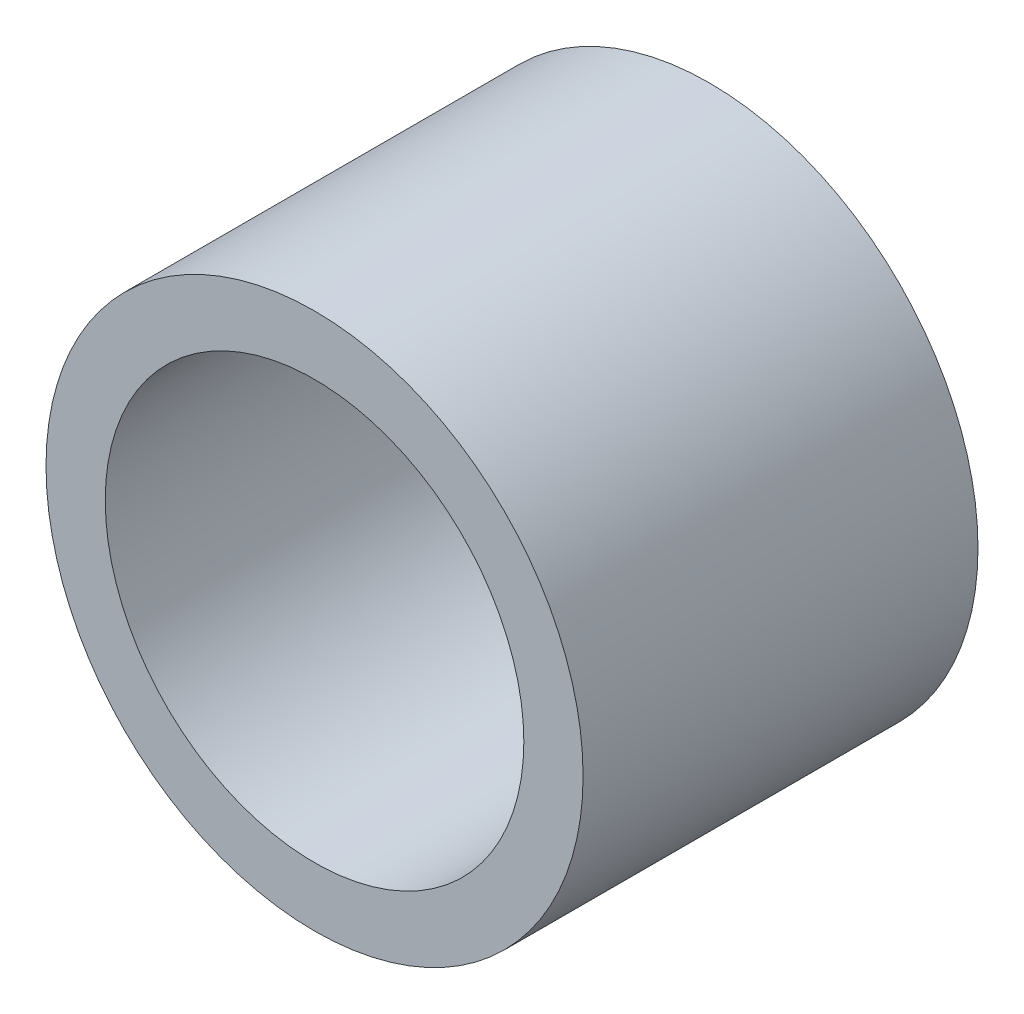
ISO-10303-21;
HEADER;
FILE_DESCRIPTION(('STEP AP214'),'2;1');
FILE_NAME('part.step','',(''),(''),'','','');
FILE_SCHEMA(('AUTOMOTIVE_DESIGN { 1 0 10303 214 1 1 1 1 }'));
ENDSEC;
DATA;
#1=APPLICATION_CONTEXT('core data for automotive mechanical design processes');
#2=APPLICATION_PROTOCOL_DEFINITION('international standard','automotive_design',2000,#1);
#3=PRODUCT_CONTEXT('',#1,'mechanical');
#4=PRODUCT('Part','Part','',(#3));
#5=PRODUCT_RELATED_PRODUCT_CATEGORY('part','',(#4));
#6=PRODUCT_DEFINITION_FORMATION('','',#4);
#7=PRODUCT_DEFINITION_CONTEXT('part definition',#1,'design');
#8=PRODUCT_DEFINITION('design','',#6,#7);
#9=PRODUCT_DEFINITION_SHAPE('','',#8);
#10=(LENGTH_UNIT() NAMED_UNIT(*) SI_UNIT(.MILLI.,.METRE.));
#11=(NAMED_UNIT(*) PLANE_ANGLE_UNIT() SI_UNIT($,.RADIAN.));
#12=(NAMED_UNIT(*) SI_UNIT($,.STERADIAN.) SOLID_ANGLE_UNIT());
#13=UNCERTAINTY_MEASURE_WITH_UNIT(LENGTH_MEASURE(1.E-05),#10,'distance_accuracy_value','');
#14=(GEOMETRIC_REPRESENTATION_CONTEXT(3) GLOBAL_UNCERTAINTY_ASSIGNED_CONTEXT((#13)) GLOBAL_UNIT_ASSIGNED_CONTEXT((#10,
#11,#12)) REPRESENTATION_CONTEXT('',''));
#15=CARTESIAN_POINT('',(0.,0.,0.));
#16=DIRECTION('',(0.,0.,1.));
#17=DIRECTION('',(1.,0.,0.));
#18=AXIS2_PLACEMENT_3D('',#15,#16,#17);
#19=CARTESIAN_POINT('',(0.,0.,5.));
#20=DIRECTION('',(0.,0.,1.));
#21=DIRECTION('',(1.,0.,0.));
#22=AXIS2_PLACEMENT_3D('',#19,#20,#21);
#23=PLANE('',#22);
#24=CARTESIAN_POINT('',(0.,0.,5.));
#25=DIRECTION('',(0.,0.,1.));
#26=DIRECTION('',(1.,0.,0.));
#27=AXIS2_PLACEMENT_3D('',#24,#25,#26);
#28=CIRCLE('',#27,3.4);
#29=CARTESIAN_POINT('',(3.4,0.,5.));
#30=VERTEX_POINT('',#29);
#31=EDGE_CURVE('E10',#30,#30,#28,.T.);
#32=ORIENTED_EDGE('',*,*,#31,.T.);
#33=EDGE_LOOP('',(#32));
#34=FACE_BOUND('',#33,.T.);
#35=CARTESIAN_POINT('',(0.,0.,5.));
#36=DIRECTION('',(0.,0.,1.));
#37=DIRECTION('',(1.,0.,0.));
#38=AXIS2_PLACEMENT_3D('',#35,#36,#37);
#39=CIRCLE('',#38,2.65);
#40=CARTESIAN_POINT('',(2.65,0.,5.));
#41=VERTEX_POINT('',#40);
#42=EDGE_CURVE('E56',#41,#41,#39,.T.);
#43=ORIENTED_EDGE('',*,*,#42,.F.);
#44=EDGE_LOOP('',(#43));
#45=FACE_BOUND('',#44,.T.);
#46=ADVANCED_FACE('F43',(#34,#45),#23,.T.);
#47=CARTESIAN_POINT('',(0.,0.,0.));
#48=DIRECTION('',(0.,0.,1.));
#49=DIRECTION('',(1.,0.,0.));
#50=AXIS2_PLACEMENT_3D('',#47,#48,#49);
#51=PLANE('',#50);
#52=CARTESIAN_POINT('',(0.,0.,0.));
#53=DIRECTION('',(0.,0.,1.));
#54=DIRECTION('',(1.,0.,0.));
#55=AXIS2_PLACEMENT_3D('',#52,#53,#54);
#56=CIRCLE('',#55,3.4);
#57=CARTESIAN_POINT('',(3.4,0.,0.));
#58=VERTEX_POINT('',#57);
#59=EDGE_CURVE('E47',#58,#58,#56,.T.);
#60=ORIENTED_EDGE('',*,*,#59,.F.);
#61=EDGE_LOOP('',(#60));
#62=FACE_BOUND('',#61,.T.);
#63=CARTESIAN_POINT('',(0.,0.,0.));
#64=DIRECTION('',(0.,0.,1.));
#65=DIRECTION('',(1.,0.,0.));
#66=AXIS2_PLACEMENT_3D('',#63,#64,#65);
#67=CIRCLE('',#66,2.65);
#68=CARTESIAN_POINT('',(2.65,0.,0.));
#69=VERTEX_POINT('',#68);
#70=EDGE_CURVE('E58',#69,#69,#67,.T.);
#71=ORIENTED_EDGE('',*,*,#70,.T.);
#72=EDGE_LOOP('',(#71));
#73=FACE_BOUND('',#72,.T.);
#74=ADVANCED_FACE('F70',(#62,#73),#51,.F.);
#75=CARTESIAN_POINT('',(0.,0.,5.));
#76=DIRECTION('',(0.,0.,-1.));
#77=DIRECTION('',(-1.,0.,0.));
#78=AXIS2_PLACEMENT_3D('',#75,#76,#77);
#79=CYLINDRICAL_SURFACE('',#78,3.4);
#80=ORIENTED_EDGE('',*,*,#31,.F.);
#81=EDGE_LOOP('',(#80));
#82=FACE_BOUND('',#81,.T.);
#83=ORIENTED_EDGE('',*,*,#59,.T.);
#84=EDGE_LOOP('',(#83));
#85=FACE_BOUND('',#84,.T.);
#86=ADVANCED_FACE('F45',(#82,#85),#79,.T.);
#87=CARTESIAN_POINT('',(0.,0.,5.));
#88=DIRECTION('',(0.,0.,-1.));
#89=DIRECTION('',(-1.,0.,0.));
#90=AXIS2_PLACEMENT_3D('',#87,#88,#89);
#91=CYLINDRICAL_SURFACE('',#90,2.65);
#92=ORIENTED_EDGE('',*,*,#42,.T.);
#93=EDGE_LOOP('',(#92));
#94=FACE_BOUND('',#93,.T.);
#95=ORIENTED_EDGE('',*,*,#70,.F.);
#96=EDGE_LOOP('',(#95));
#97=FACE_BOUND('',#96,.T.);
#98=ADVANCED_FACE('F66',(#94,#97),#91,.F.);
#99=CLOSED_SHELL('',(#46,#74,#86,#98));
#100=MANIFOLD_SOLID_BREP('B2',#99);
#101=ADVANCED_BREP_SHAPE_REPRESENTATION('',(#18,#100),#14);
#102=SHAPE_DEFINITION_REPRESENTATION(#9,#101);
ENDSEC;
END-ISO-10303-21;
